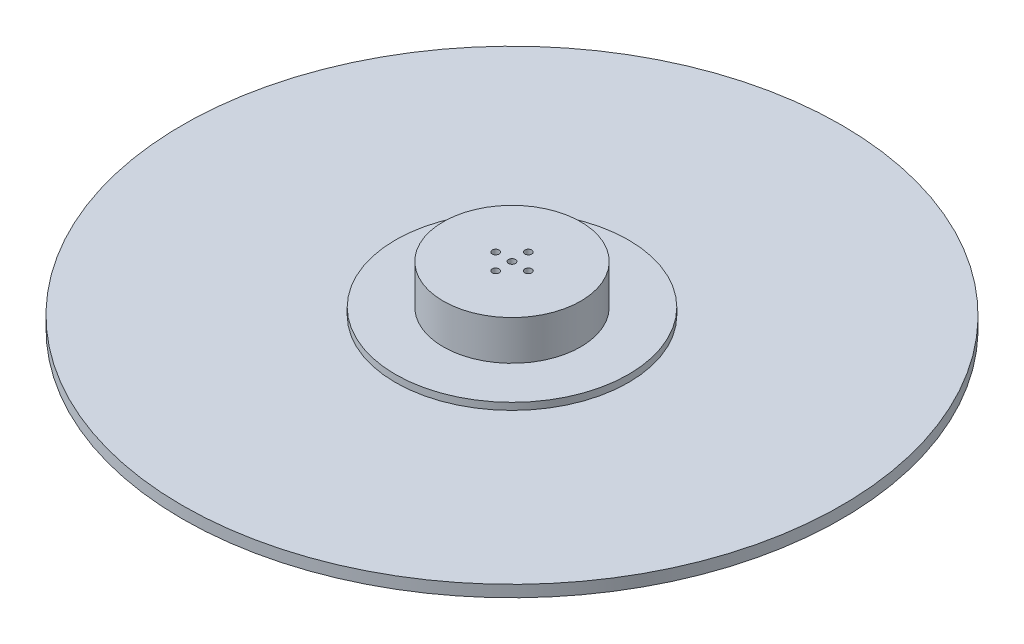
ISO-10303-21;
HEADER;
FILE_DESCRIPTION(('STEP AP214'),'2;1');
FILE_NAME('part.step','',(''),(''),'','','');
FILE_SCHEMA(('AUTOMOTIVE_DESIGN { 1 0 10303 214 1 1 1 1 }'));
ENDSEC;
DATA;
#1=APPLICATION_CONTEXT('core data for automotive mechanical design processes');
#2=APPLICATION_PROTOCOL_DEFINITION('international standard','automotive_design',2000,#1);
#3=PRODUCT_CONTEXT('',#1,'mechanical');
#4=PRODUCT('Part','Part','',(#3));
#5=PRODUCT_RELATED_PRODUCT_CATEGORY('part','',(#4));
#6=PRODUCT_DEFINITION_FORMATION('','',#4);
#7=PRODUCT_DEFINITION_CONTEXT('part definition',#1,'design');
#8=PRODUCT_DEFINITION('design','',#6,#7);
#9=PRODUCT_DEFINITION_SHAPE('','',#8);
#10=(LENGTH_UNIT() NAMED_UNIT(*) SI_UNIT(.MILLI.,.METRE.));
#11=(NAMED_UNIT(*) PLANE_ANGLE_UNIT() SI_UNIT($,.RADIAN.));
#12=(NAMED_UNIT(*) SI_UNIT($,.STERADIAN.) SOLID_ANGLE_UNIT());
#13=UNCERTAINTY_MEASURE_WITH_UNIT(LENGTH_MEASURE(1.E-05),#10,'distance_accuracy_value','');
#14=(GEOMETRIC_REPRESENTATION_CONTEXT(3) GLOBAL_UNCERTAINTY_ASSIGNED_CONTEXT((#13)) GLOBAL_UNIT_ASSIGNED_CONTEXT((#10,
#11,#12)) REPRESENTATION_CONTEXT('',''));
#15=CARTESIAN_POINT('',(0.,0.,0.));
#16=DIRECTION('',(0.,0.,1.));
#17=DIRECTION('',(1.,0.,0.));
#18=AXIS2_PLACEMENT_3D('',#15,#16,#17);
#19=CARTESIAN_POINT('',(0.,5.,0.));
#20=DIRECTION('',(0.,-1.,0.));
#21=DIRECTION('',(0.,0.,-1.));
#22=AXIS2_PLACEMENT_3D('',#19,#20,#21);
#23=CYLINDRICAL_SURFACE('',#22,141.4);
#24=CARTESIAN_POINT('',(0.,5.,0.));
#25=DIRECTION('',(0.,1.,0.));
#26=DIRECTION('',(0.,0.,1.));
#27=AXIS2_PLACEMENT_3D('',#24,#25,#26);
#28=CIRCLE('',#27,141.4);
#29=CARTESIAN_POINT('',(0.,5.,141.4));
#30=VERTEX_POINT('',#29);
#31=EDGE_CURVE('E51',#30,#30,#28,.T.);
#32=ORIENTED_EDGE('',*,*,#31,.F.);
#33=EDGE_LOOP('',(#32));
#34=FACE_BOUND('',#33,.T.);
#35=CARTESIAN_POINT('',(0.,0.,0.));
#36=DIRECTION('',(0.,1.,0.));
#37=DIRECTION('',(0.,0.,1.));
#38=AXIS2_PLACEMENT_3D('',#35,#36,#37);
#39=CIRCLE('',#38,141.4);
#40=CARTESIAN_POINT('',(0.,0.,141.4));
#41=VERTEX_POINT('',#40);
#42=EDGE_CURVE('E45',#41,#41,#39,.T.);
#43=ORIENTED_EDGE('',*,*,#42,.T.);
#44=EDGE_LOOP('',(#43));
#45=FACE_BOUND('',#44,.T.);
#46=ADVANCED_FACE('F39',(#34,#45),#23,.T.);
#47=CARTESIAN_POINT('',(0.,5.,0.));
#48=DIRECTION('',(0.,1.,0.));
#49=DIRECTION('',(0.,0.,1.));
#50=AXIS2_PLACEMENT_3D('',#47,#48,#49);
#51=PLANE('',#50);
#52=CARTESIAN_POINT('',(0.,5.,0.));
#53=DIRECTION('',(0.,1.,0.));
#54=DIRECTION('',(0.,0.,1.));
#55=AXIS2_PLACEMENT_3D('',#52,#53,#54);
#56=CIRCLE('',#55,50.);
#57=CARTESIAN_POINT('',(0.,5.,50.));
#58=VERTEX_POINT('',#57);
#59=EDGE_CURVE('E46',#58,#58,#56,.T.);
#60=ORIENTED_EDGE('',*,*,#59,.F.);
#61=EDGE_LOOP('',(#60));
#62=FACE_BOUND('',#61,.T.);
#63=ORIENTED_EDGE('',*,*,#31,.T.);
#64=EDGE_LOOP('',(#63));
#65=FACE_BOUND('',#64,.T.);
#66=ADVANCED_FACE('F68',(#62,#65),#51,.T.);
#67=CARTESIAN_POINT('',(0.,0.,0.));
#68=DIRECTION('',(0.,1.,0.));
#69=DIRECTION('',(0.,0.,1.));
#70=AXIS2_PLACEMENT_3D('',#67,#68,#69);
#71=PLANE('',#70);
#72=CARTESIAN_POINT('',(0.,0.,0.));
#73=DIRECTION('',(0.,-1.,0.));
#74=DIRECTION('',(0.,0.,-1.));
#75=AXIS2_PLACEMENT_3D('',#72,#73,#74);
#76=CIRCLE('',#75,27.);
#77=CARTESIAN_POINT('',(0.,0.,-27.));
#78=VERTEX_POINT('',#77);
#79=EDGE_CURVE('E223',#78,#78,#76,.T.);
#80=ORIENTED_EDGE('',*,*,#79,.F.);
#81=EDGE_LOOP('',(#80));
#82=FACE_BOUND('',#81,.T.);
#83=ORIENTED_EDGE('',*,*,#42,.F.);
#84=EDGE_LOOP('',(#83));
#85=FACE_BOUND('',#84,.T.);
#86=ADVANCED_FACE('F66',(#82,#85),#71,.F.);
#87=CARTESIAN_POINT('',(0.,8.,0.));
#88=DIRECTION('',(0.,-1.,0.));
#89=DIRECTION('',(0.,0.,-1.));
#90=AXIS2_PLACEMENT_3D('',#87,#88,#89);
#91=CYLINDRICAL_SURFACE('',#90,50.);
#92=CARTESIAN_POINT('',(0.,8.,0.));
#93=DIRECTION('',(0.,1.,0.));
#94=DIRECTION('',(0.,0.,1.));
#95=AXIS2_PLACEMENT_3D('',#92,#93,#94);
#96=CIRCLE('',#95,50.);
#97=CARTESIAN_POINT('',(0.,8.,50.));
#98=VERTEX_POINT('',#97);
#99=EDGE_CURVE('E60',#98,#98,#96,.T.);
#100=ORIENTED_EDGE('',*,*,#99,.F.);
#101=EDGE_LOOP('',(#100));
#102=FACE_BOUND('',#101,.T.);
#103=ORIENTED_EDGE('',*,*,#59,.T.);
#104=EDGE_LOOP('',(#103));
#105=FACE_BOUND('',#104,.T.);
#106=ADVANCED_FACE('F69',(#102,#105),#91,.T.);
#107=CARTESIAN_POINT('',(0.,8.,0.));
#108=DIRECTION('',(0.,1.,0.));
#109=DIRECTION('',(0.,0.,1.));
#110=AXIS2_PLACEMENT_3D('',#107,#108,#109);
#111=PLANE('',#110);
#112=CARTESIAN_POINT('',(0.,8.,0.));
#113=DIRECTION('',(0.,1.,0.));
#114=DIRECTION('',(0.,0.,1.));
#115=AXIS2_PLACEMENT_3D('',#112,#113,#114);
#116=CIRCLE('',#115,29.5);
#117=CARTESIAN_POINT('',(0.,8.,29.5));
#118=VERTEX_POINT('',#117);
#119=EDGE_CURVE('E10',#118,#118,#116,.T.);
#120=ORIENTED_EDGE('',*,*,#119,.F.);
#121=EDGE_LOOP('',(#120));
#122=FACE_BOUND('',#121,.T.);
#123=ORIENTED_EDGE('',*,*,#99,.T.);
#124=EDGE_LOOP('',(#123));
#125=FACE_BOUND('',#124,.T.);
#126=ADVANCED_FACE('F77',(#122,#125),#111,.T.);
#127=CARTESIAN_POINT('',(0.,25.,0.));
#128=DIRECTION('',(0.,-1.,0.));
#129=DIRECTION('',(0.,0.,-1.));
#130=AXIS2_PLACEMENT_3D('',#127,#128,#129);
#131=CYLINDRICAL_SURFACE('',#130,29.5);
#132=CARTESIAN_POINT('',(0.,25.,0.));
#133=DIRECTION('',(0.,1.,0.));
#134=DIRECTION('',(0.,0.,1.));
#135=AXIS2_PLACEMENT_3D('',#132,#133,#134);
#136=CIRCLE('',#135,29.5);
#137=CARTESIAN_POINT('',(0.,25.,29.5));
#138=VERTEX_POINT('',#137);
#139=EDGE_CURVE('E54',#138,#138,#136,.T.);
#140=ORIENTED_EDGE('',*,*,#139,.F.);
#141=EDGE_LOOP('',(#140));
#142=FACE_BOUND('',#141,.T.);
#143=ORIENTED_EDGE('',*,*,#119,.T.);
#144=EDGE_LOOP('',(#143));
#145=FACE_BOUND('',#144,.T.);
#146=ADVANCED_FACE('F101',(#142,#145),#131,.T.);
#147=CARTESIAN_POINT('',(0.,25.,0.));
#148=DIRECTION('',(0.,1.,0.));
#149=DIRECTION('',(0.,0.,1.));
#150=AXIS2_PLACEMENT_3D('',#147,#148,#149);
#151=PLANE('',#150);
#152=CARTESIAN_POINT('',(0.,25.,7.));
#153=DIRECTION('',(0.,-1.,0.));
#154=DIRECTION('',(0.,0.,-1.));
#155=AXIS2_PLACEMENT_3D('',#152,#153,#154);
#156=CIRCLE('',#155,1.5);
#157=CARTESIAN_POINT('',(0.,25.,5.5));
#158=VERTEX_POINT('',#157);
#159=EDGE_CURVE('E198',#158,#158,#156,.T.);
#160=ORIENTED_EDGE('',*,*,#159,.T.);
#161=EDGE_LOOP('',(#160));
#162=FACE_BOUND('',#161,.T.);
#163=CARTESIAN_POINT('',(7.,25.,0.));
#164=DIRECTION('',(0.,-1.,0.));
#165=DIRECTION('',(0.,0.,-1.));
#166=AXIS2_PLACEMENT_3D('',#163,#164,#165);
#167=CIRCLE('',#166,1.5);
#168=CARTESIAN_POINT('',(7.,25.,-1.50000000000002));
#169=VERTEX_POINT('',#168);
#170=EDGE_CURVE('E216',#169,#169,#167,.T.);
#171=ORIENTED_EDGE('',*,*,#170,.T.);
#172=EDGE_LOOP('',(#171));
#173=FACE_BOUND('',#172,.T.);
#174=CARTESIAN_POINT('',(0.,25.,-7.));
#175=DIRECTION('',(0.,-1.,0.));
#176=DIRECTION('',(0.,0.,-1.));
#177=AXIS2_PLACEMENT_3D('',#174,#175,#176);
#178=CIRCLE('',#177,1.5);
#179=CARTESIAN_POINT('',(0.,25.,-8.5));
#180=VERTEX_POINT('',#179);
#181=EDGE_CURVE('E239',#180,#180,#178,.T.);
#182=ORIENTED_EDGE('',*,*,#181,.T.);
#183=EDGE_LOOP('',(#182));
#184=FACE_BOUND('',#183,.T.);
#185=CARTESIAN_POINT('',(-7.,25.,0.));
#186=DIRECTION('',(0.,-1.,0.));
#187=DIRECTION('',(0.,0.,-1.));
#188=AXIS2_PLACEMENT_3D('',#185,#186,#187);
#189=CIRCLE('',#188,1.5);
#190=CARTESIAN_POINT('',(-7.,25.,-1.49999999999993));
#191=VERTEX_POINT('',#190);
#192=EDGE_CURVE('E212',#191,#191,#189,.T.);
#193=ORIENTED_EDGE('',*,*,#192,.T.);
#194=EDGE_LOOP('',(#193));
#195=FACE_BOUND('',#194,.T.);
#196=CARTESIAN_POINT('',(0.,25.,0.));
#197=DIRECTION('',(0.,-1.,0.));
#198=DIRECTION('',(0.,0.,-1.));
#199=AXIS2_PLACEMENT_3D('',#196,#197,#198);
#200=CIRCLE('',#199,1.5);
#201=CARTESIAN_POINT('',(0.,25.,-1.5));
#202=VERTEX_POINT('',#201);
#203=EDGE_CURVE('E207',#202,#202,#200,.T.);
#204=ORIENTED_EDGE('',*,*,#203,.T.);
#205=EDGE_LOOP('',(#204));
#206=FACE_BOUND('',#205,.T.);
#207=ORIENTED_EDGE('',*,*,#139,.T.);
#208=EDGE_LOOP('',(#207));
#209=FACE_BOUND('',#208,.T.);
#210=ADVANCED_FACE('F111',(#162,#173,#184,#195,#206,#209),#151,.T.);
#211=CARTESIAN_POINT('',(0.,22.,0.));
#212=DIRECTION('',(0.,-1.,0.));
#213=DIRECTION('',(0.,0.,-1.));
#214=AXIS2_PLACEMENT_3D('',#211,#212,#213);
#215=CYLINDRICAL_SURFACE('',#214,27.);
#216=CARTESIAN_POINT('',(0.,22.,0.));
#217=DIRECTION('',(0.,-1.,0.));
#218=DIRECTION('',(0.,0.,-1.));
#219=AXIS2_PLACEMENT_3D('',#216,#217,#218);
#220=CIRCLE('',#219,27.);
#221=CARTESIAN_POINT('',(0.,22.,-27.));
#222=VERTEX_POINT('',#221);
#223=EDGE_CURVE('E222',#222,#222,#220,.T.);
#224=ORIENTED_EDGE('',*,*,#223,.F.);
#225=EDGE_LOOP('',(#224));
#226=FACE_BOUND('',#225,.T.);
#227=ORIENTED_EDGE('',*,*,#79,.T.);
#228=EDGE_LOOP('',(#227));
#229=FACE_BOUND('',#228,.T.);
#230=ADVANCED_FACE('F121',(#226,#229),#215,.F.);
#231=CARTESIAN_POINT('',(0.,22.,0.));
#232=DIRECTION('',(0.,-1.,0.));
#233=DIRECTION('',(0.,0.,-1.));
#234=AXIS2_PLACEMENT_3D('',#231,#232,#233);
#235=PLANE('',#234);
#236=CARTESIAN_POINT('',(0.,22.,7.));
#237=DIRECTION('',(0.,-1.,0.));
#238=DIRECTION('',(0.,0.,-1.));
#239=AXIS2_PLACEMENT_3D('',#236,#237,#238);
#240=CIRCLE('',#239,1.5);
#241=CARTESIAN_POINT('',(0.,22.,5.5));
#242=VERTEX_POINT('',#241);
#243=EDGE_CURVE('E204',#242,#242,#240,.T.);
#244=ORIENTED_EDGE('',*,*,#243,.F.);
#245=EDGE_LOOP('',(#244));
#246=FACE_BOUND('',#245,.T.);
#247=CARTESIAN_POINT('',(7.,22.,0.));
#248=DIRECTION('',(0.,-1.,0.));
#249=DIRECTION('',(0.,0.,-1.));
#250=AXIS2_PLACEMENT_3D('',#247,#248,#249);
#251=CIRCLE('',#250,1.5);
#252=CARTESIAN_POINT('',(7.,22.,-1.50000000000002));
#253=VERTEX_POINT('',#252);
#254=EDGE_CURVE('E206',#253,#253,#251,.T.);
#255=ORIENTED_EDGE('',*,*,#254,.F.);
#256=EDGE_LOOP('',(#255));
#257=FACE_BOUND('',#256,.T.);
#258=CARTESIAN_POINT('',(0.,22.,-7.));
#259=DIRECTION('',(0.,-1.,0.));
#260=DIRECTION('',(0.,0.,-1.));
#261=AXIS2_PLACEMENT_3D('',#258,#259,#260);
#262=CIRCLE('',#261,1.5);
#263=CARTESIAN_POINT('',(0.,22.,-8.5));
#264=VERTEX_POINT('',#263);
#265=EDGE_CURVE('E218',#264,#264,#262,.T.);
#266=ORIENTED_EDGE('',*,*,#265,.F.);
#267=EDGE_LOOP('',(#266));
#268=FACE_BOUND('',#267,.T.);
#269=CARTESIAN_POINT('',(-7.,22.,0.));
#270=DIRECTION('',(0.,-1.,0.));
#271=DIRECTION('',(0.,0.,-1.));
#272=AXIS2_PLACEMENT_3D('',#269,#270,#271);
#273=CIRCLE('',#272,1.5);
#274=CARTESIAN_POINT('',(-7.,22.,-1.49999999999993));
#275=VERTEX_POINT('',#274);
#276=EDGE_CURVE('E244',#275,#275,#273,.T.);
#277=ORIENTED_EDGE('',*,*,#276,.F.);
#278=EDGE_LOOP('',(#277));
#279=FACE_BOUND('',#278,.T.);
#280=CARTESIAN_POINT('',(0.,22.,0.));
#281=DIRECTION('',(0.,-1.,0.));
#282=DIRECTION('',(0.,0.,-1.));
#283=AXIS2_PLACEMENT_3D('',#280,#281,#282);
#284=CIRCLE('',#283,1.5);
#285=CARTESIAN_POINT('',(0.,22.,-1.5));
#286=VERTEX_POINT('',#285);
#287=EDGE_CURVE('E202',#286,#286,#284,.T.);
#288=ORIENTED_EDGE('',*,*,#287,.F.);
#289=EDGE_LOOP('',(#288));
#290=FACE_BOUND('',#289,.T.);
#291=ORIENTED_EDGE('',*,*,#223,.T.);
#292=EDGE_LOOP('',(#291));
#293=FACE_BOUND('',#292,.T.);
#294=ADVANCED_FACE('F133',(#246,#257,#268,#279,#290,#293),#235,.T.);
#295=CARTESIAN_POINT('',(0.,25.,0.));
#296=DIRECTION('',(0.,-1.,0.));
#297=DIRECTION('',(0.,0.,-1.));
#298=AXIS2_PLACEMENT_3D('',#295,#296,#297);
#299=CYLINDRICAL_SURFACE('',#298,1.5);
#300=ORIENTED_EDGE('',*,*,#203,.F.);
#301=EDGE_LOOP('',(#300));
#302=FACE_BOUND('',#301,.T.);
#303=ORIENTED_EDGE('',*,*,#287,.T.);
#304=EDGE_LOOP('',(#303));
#305=FACE_BOUND('',#304,.T.);
#306=ADVANCED_FACE('F141',(#302,#305),#299,.F.);
#307=CARTESIAN_POINT('',(-7.,25.,0.));
#308=DIRECTION('',(0.,-1.,0.));
#309=DIRECTION('',(0.,0.,-1.));
#310=AXIS2_PLACEMENT_3D('',#307,#308,#309);
#311=CYLINDRICAL_SURFACE('',#310,1.5);
#312=ORIENTED_EDGE('',*,*,#192,.F.);
#313=EDGE_LOOP('',(#312));
#314=FACE_BOUND('',#313,.T.);
#315=ORIENTED_EDGE('',*,*,#276,.T.);
#316=EDGE_LOOP('',(#315));
#317=FACE_BOUND('',#316,.T.);
#318=ADVANCED_FACE('F154',(#314,#317),#311,.F.);
#319=CARTESIAN_POINT('',(0.,25.,-7.));
#320=DIRECTION('',(0.,-1.,0.));
#321=DIRECTION('',(0.,0.,-1.));
#322=AXIS2_PLACEMENT_3D('',#319,#320,#321);
#323=CYLINDRICAL_SURFACE('',#322,1.5);
#324=ORIENTED_EDGE('',*,*,#181,.F.);
#325=EDGE_LOOP('',(#324));
#326=FACE_BOUND('',#325,.T.);
#327=ORIENTED_EDGE('',*,*,#265,.T.);
#328=EDGE_LOOP('',(#327));
#329=FACE_BOUND('',#328,.T.);
#330=ADVANCED_FACE('F161',(#326,#329),#323,.F.);
#331=CARTESIAN_POINT('',(7.,25.,0.));
#332=DIRECTION('',(0.,-1.,0.));
#333=DIRECTION('',(0.,0.,-1.));
#334=AXIS2_PLACEMENT_3D('',#331,#332,#333);
#335=CYLINDRICAL_SURFACE('',#334,1.5);
#336=ORIENTED_EDGE('',*,*,#170,.F.);
#337=EDGE_LOOP('',(#336));
#338=FACE_BOUND('',#337,.T.);
#339=ORIENTED_EDGE('',*,*,#254,.T.);
#340=EDGE_LOOP('',(#339));
#341=FACE_BOUND('',#340,.T.);
#342=ADVANCED_FACE('F173',(#338,#341),#335,.F.);
#343=CARTESIAN_POINT('',(0.,25.,7.));
#344=DIRECTION('',(0.,-1.,0.));
#345=DIRECTION('',(0.,0.,-1.));
#346=AXIS2_PLACEMENT_3D('',#343,#344,#345);
#347=CYLINDRICAL_SURFACE('',#346,1.5);
#348=ORIENTED_EDGE('',*,*,#159,.F.);
#349=EDGE_LOOP('',(#348));
#350=FACE_BOUND('',#349,.T.);
#351=ORIENTED_EDGE('',*,*,#243,.T.);
#352=EDGE_LOOP('',(#351));
#353=FACE_BOUND('',#352,.T.);
#354=ADVANCED_FACE('F182',(#350,#353),#347,.F.);
#355=CLOSED_SHELL('',(#46,#66,#86,#106,#126,#146,#210,#230,#294,#306,#318,#330,#342,#354));
#356=MANIFOLD_SOLID_BREP('B2',#355);
#357=ADVANCED_BREP_SHAPE_REPRESENTATION('',(#18,#356),#14);
#358=SHAPE_DEFINITION_REPRESENTATION(#9,#357);
ENDSEC;
END-ISO-10303-21;
